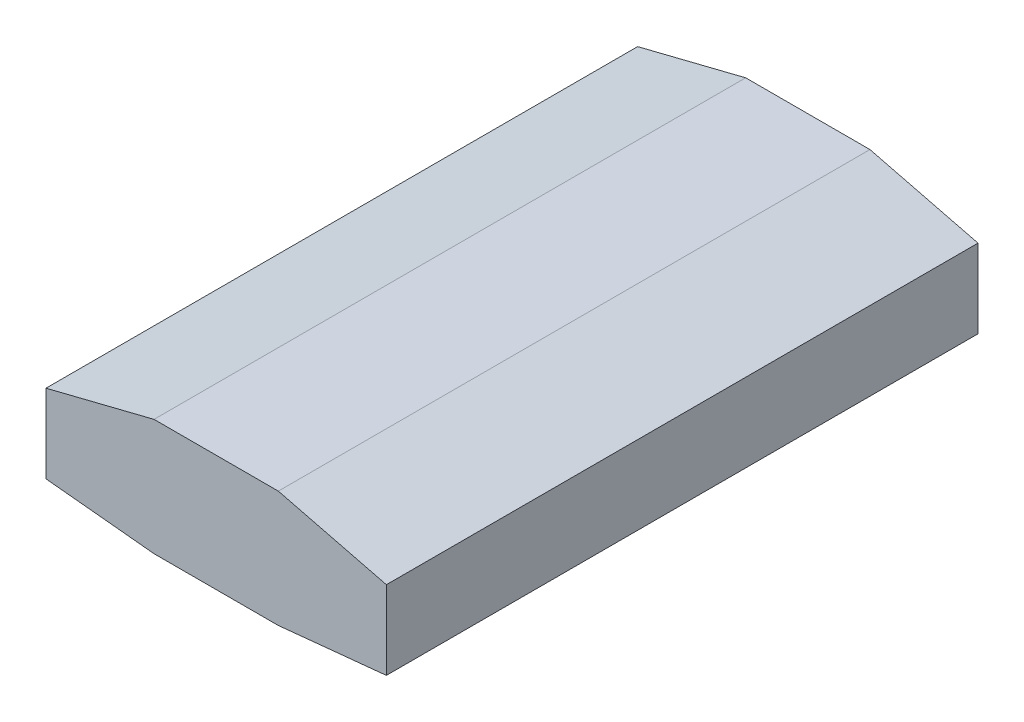
ISO-10303-21;
HEADER;
FILE_DESCRIPTION(('STEP AP214'),'2;1');
FILE_NAME('part.step','',(''),(''),'','','');
FILE_SCHEMA(('AUTOMOTIVE_DESIGN { 1 0 10303 214 1 1 1 1 }'));
ENDSEC;
DATA;
#1=APPLICATION_CONTEXT('core data for automotive mechanical design processes');
#2=APPLICATION_PROTOCOL_DEFINITION('international standard','automotive_design',2000,#1);
#3=PRODUCT_CONTEXT('',#1,'mechanical');
#4=PRODUCT('Part','Part','',(#3));
#5=PRODUCT_RELATED_PRODUCT_CATEGORY('part','',(#4));
#6=PRODUCT_DEFINITION_FORMATION('','',#4);
#7=PRODUCT_DEFINITION_CONTEXT('part definition',#1,'design');
#8=PRODUCT_DEFINITION('design','',#6,#7);
#9=PRODUCT_DEFINITION_SHAPE('','',#8);
#10=(LENGTH_UNIT() NAMED_UNIT(*) SI_UNIT(.MILLI.,.METRE.));
#11=(NAMED_UNIT(*) PLANE_ANGLE_UNIT() SI_UNIT($,.RADIAN.));
#12=(NAMED_UNIT(*) SI_UNIT($,.STERADIAN.) SOLID_ANGLE_UNIT());
#13=UNCERTAINTY_MEASURE_WITH_UNIT(LENGTH_MEASURE(1.E-05),#10,'distance_accuracy_value','');
#14=(GEOMETRIC_REPRESENTATION_CONTEXT(3) GLOBAL_UNCERTAINTY_ASSIGNED_CONTEXT((#13)) GLOBAL_UNIT_ASSIGNED_CONTEXT((#10,
#11,#12)) REPRESENTATION_CONTEXT('',''));
#15=CARTESIAN_POINT('',(0.,0.,0.));
#16=DIRECTION('',(0.,0.,1.));
#17=DIRECTION('',(1.,0.,0.));
#18=AXIS2_PLACEMENT_3D('',#15,#16,#17);
#19=CARTESIAN_POINT('',(31.5,10.77,109.5));
#20=DIRECTION('',(-1.,0.,0.));
#21=DIRECTION('',(0.,0.,1.));
#22=AXIS2_PLACEMENT_3D('',#19,#20,#21);
#23=PLANE('',#22);
#24=DIRECTION('',(0.,1.,0.));
#25=VECTOR('',#24,1.);
#26=CARTESIAN_POINT('',(31.5,10.77,109.5));
#27=LINE('',#26,#25);
#28=CARTESIAN_POINT('',(31.5,-8.77,109.5));
#29=VERTEX_POINT('',#28);
#30=CARTESIAN_POINT('',(31.5,5.77,109.5));
#31=VERTEX_POINT('',#30);
#32=EDGE_CURVE('E125',#29,#31,#27,.T.);
#33=ORIENTED_EDGE('',*,*,#32,.F.);
#34=DIRECTION('',(0.,0.,1.));
#35=VECTOR('',#34,1.);
#36=CARTESIAN_POINT('',(31.5,-8.77,0.));
#37=LINE('',#36,#35);
#38=CARTESIAN_POINT('',(31.5,-8.77,0.));
#39=VERTEX_POINT('',#38);
#40=EDGE_CURVE('E146',#39,#29,#37,.T.);
#41=ORIENTED_EDGE('',*,*,#40,.F.);
#42=DIRECTION('',(0.,1.,0.));
#43=VECTOR('',#42,1.);
#44=CARTESIAN_POINT('',(31.5,10.77,0.));
#45=LINE('',#44,#43);
#46=CARTESIAN_POINT('',(31.5,5.77,0.));
#47=VERTEX_POINT('',#46);
#48=EDGE_CURVE('E126',#39,#47,#45,.T.);
#49=ORIENTED_EDGE('',*,*,#48,.T.);
#50=DIRECTION('',(0.,0.,1.));
#51=VECTOR('',#50,1.);
#52=CARTESIAN_POINT('',(31.5,5.77,0.));
#53=LINE('',#52,#51);
#54=EDGE_CURVE('E129',#47,#31,#53,.T.);
#55=ORIENTED_EDGE('',*,*,#54,.T.);
#56=EDGE_LOOP('',(#33,#41,#49,#55));
#57=FACE_BOUND('',#56,.T.);
#58=ADVANCED_FACE('F35',(#57),#23,.F.);
#59=CARTESIAN_POINT('',(-31.5,10.77,109.5));
#60=DIRECTION('',(0.,-1.,0.));
#61=DIRECTION('',(0.,0.,-1.));
#62=AXIS2_PLACEMENT_3D('',#59,#60,#61);
#63=PLANE('',#62);
#64=DIRECTION('',(-1.,0.,0.));
#65=VECTOR('',#64,1.);
#66=CARTESIAN_POINT('',(-31.5,10.77,0.));
#67=LINE('',#66,#65);
#68=CARTESIAN_POINT('',(11.5,10.77,0.));
#69=VERTEX_POINT('',#68);
#70=CARTESIAN_POINT('',(-11.5000000000001,10.77,0.));
#71=VERTEX_POINT('',#70);
#72=EDGE_CURVE('E123',#69,#71,#67,.T.);
#73=ORIENTED_EDGE('',*,*,#72,.T.);
#74=DIRECTION('',(0.,0.,1.));
#75=VECTOR('',#74,1.);
#76=CARTESIAN_POINT('',(-11.5,10.77,0.));
#77=LINE('',#76,#75);
#78=CARTESIAN_POINT('',(-11.5,10.77,109.5));
#79=VERTEX_POINT('',#78);
#80=EDGE_CURVE('E106',#71,#79,#77,.T.);
#81=ORIENTED_EDGE('',*,*,#80,.T.);
#82=DIRECTION('',(-1.,0.,0.));
#83=VECTOR('',#82,1.);
#84=CARTESIAN_POINT('',(-31.5,10.77,109.5));
#85=LINE('',#84,#83);
#86=CARTESIAN_POINT('',(11.5,10.77,109.5));
#87=VERTEX_POINT('',#86);
#88=EDGE_CURVE('E132',#87,#79,#85,.T.);
#89=ORIENTED_EDGE('',*,*,#88,.F.);
#90=DIRECTION('',(0.,0.,1.));
#91=VECTOR('',#90,1.);
#92=CARTESIAN_POINT('',(11.5,10.77,0.));
#93=LINE('',#92,#91);
#94=EDGE_CURVE('E136',#69,#87,#93,.T.);
#95=ORIENTED_EDGE('',*,*,#94,.F.);
#96=EDGE_LOOP('',(#73,#81,#89,#95));
#97=FACE_BOUND('',#96,.T.);
#98=ADVANCED_FACE('F225',(#97),#63,.F.);
#99=CARTESIAN_POINT('',(-31.5,10.77,109.5));
#100=DIRECTION('',(1.,0.,0.));
#101=DIRECTION('',(0.,0.,-1.));
#102=AXIS2_PLACEMENT_3D('',#99,#100,#101);
#103=PLANE('',#102);
#104=DIRECTION('',(0.,-1.,0.));
#105=VECTOR('',#104,1.);
#106=CARTESIAN_POINT('',(-31.5,10.77,109.5));
#107=LINE('',#106,#105);
#108=CARTESIAN_POINT('',(-31.5,5.77,109.5));
#109=VERTEX_POINT('',#108);
#110=CARTESIAN_POINT('',(-31.5,-8.77,109.5));
#111=VERTEX_POINT('',#110);
#112=EDGE_CURVE('E43',#109,#111,#107,.T.);
#113=ORIENTED_EDGE('',*,*,#112,.F.);
#114=DIRECTION('',(0.,0.,1.));
#115=VECTOR('',#114,1.);
#116=CARTESIAN_POINT('',(-31.5,5.77,0.));
#117=LINE('',#116,#115);
#118=CARTESIAN_POINT('',(-31.5,5.77,0.));
#119=VERTEX_POINT('',#118);
#120=EDGE_CURVE('E103',#119,#109,#117,.T.);
#121=ORIENTED_EDGE('',*,*,#120,.F.);
#122=DIRECTION('',(0.,-1.,0.));
#123=VECTOR('',#122,1.);
#124=CARTESIAN_POINT('',(-31.5,10.77,0.));
#125=LINE('',#124,#123);
#126=CARTESIAN_POINT('',(-31.5,-8.77,0.));
#127=VERTEX_POINT('',#126);
#128=EDGE_CURVE('E117',#119,#127,#125,.T.);
#129=ORIENTED_EDGE('',*,*,#128,.T.);
#130=DIRECTION('',(0.,0.,1.));
#131=VECTOR('',#130,1.);
#132=CARTESIAN_POINT('',(-31.5,-8.77,0.));
#133=LINE('',#132,#131);
#134=EDGE_CURVE('E51',#127,#111,#133,.T.);
#135=ORIENTED_EDGE('',*,*,#134,.T.);
#136=EDGE_LOOP('',(#113,#121,#129,#135));
#137=FACE_BOUND('',#136,.T.);
#138=ADVANCED_FACE('F116',(#137),#103,.F.);
#139=CARTESIAN_POINT('',(-31.5,-10.77,109.5));
#140=DIRECTION('',(0.,1.,0.));
#141=DIRECTION('',(0.,0.,1.));
#142=AXIS2_PLACEMENT_3D('',#139,#140,#141);
#143=PLANE('',#142);
#144=CARTESIAN_POINT('',(7.,-10.77,5.));
#145=DIRECTION('',(0.,-1.,0.));
#146=DIRECTION('',(0.,0.,-1.));
#147=AXIS2_PLACEMENT_3D('',#144,#145,#146);
#148=CIRCLE('',#147,1.);
#149=CARTESIAN_POINT('',(7.,-10.77,4.));
#150=VERTEX_POINT('',#149);
#151=EDGE_CURVE('E180',#150,#150,#148,.T.);
#152=ORIENTED_EDGE('',*,*,#151,.F.);
#153=EDGE_LOOP('',(#152));
#154=FACE_BOUND('',#153,.T.);
#155=CARTESIAN_POINT('',(-7.,-10.77,85.));
#156=DIRECTION('',(0.,-1.,0.));
#157=DIRECTION('',(0.,0.,-1.));
#158=AXIS2_PLACEMENT_3D('',#155,#156,#157);
#159=CIRCLE('',#158,1.);
#160=CARTESIAN_POINT('',(-7.,-10.77,84.));
#161=VERTEX_POINT('',#160);
#162=EDGE_CURVE('E174',#161,#161,#159,.T.);
#163=ORIENTED_EDGE('',*,*,#162,.F.);
#164=EDGE_LOOP('',(#163));
#165=FACE_BOUND('',#164,.T.);
#166=CARTESIAN_POINT('',(7.,-10.77,85.));
#167=DIRECTION('',(0.,-1.,0.));
#168=DIRECTION('',(0.,0.,-1.));
#169=AXIS2_PLACEMENT_3D('',#166,#167,#168);
#170=CIRCLE('',#169,1.);
#171=CARTESIAN_POINT('',(7.,-10.77,84.));
#172=VERTEX_POINT('',#171);
#173=EDGE_CURVE('E168',#172,#172,#170,.T.);
#174=ORIENTED_EDGE('',*,*,#173,.F.);
#175=EDGE_LOOP('',(#174));
#176=FACE_BOUND('',#175,.T.);
#177=CARTESIAN_POINT('',(-7.,-10.77,5.));
#178=DIRECTION('',(0.,-1.,0.));
#179=DIRECTION('',(0.,0.,-1.));
#180=AXIS2_PLACEMENT_3D('',#177,#178,#179);
#181=CIRCLE('',#180,1.);
#182=CARTESIAN_POINT('',(-7.,-10.77,4.));
#183=VERTEX_POINT('',#182);
#184=EDGE_CURVE('E162',#183,#183,#181,.T.);
#185=ORIENTED_EDGE('',*,*,#184,.F.);
#186=EDGE_LOOP('',(#185));
#187=FACE_BOUND('',#186,.T.);
#188=DIRECTION('',(1.,0.,0.));
#189=VECTOR('',#188,1.);
#190=CARTESIAN_POINT('',(-31.5,-10.77,109.5));
#191=LINE('',#190,#189);
#192=CARTESIAN_POINT('',(-11.5,-10.77,109.5));
#193=VERTEX_POINT('',#192);
#194=CARTESIAN_POINT('',(11.5,-10.77,109.5));
#195=VERTEX_POINT('',#194);
#196=EDGE_CURVE('E11',#193,#195,#191,.T.);
#197=ORIENTED_EDGE('',*,*,#196,.F.);
#198=DIRECTION('',(0.,0.,1.));
#199=VECTOR('',#198,1.);
#200=CARTESIAN_POINT('',(-11.5,-10.77,0.));
#201=LINE('',#200,#199);
#202=CARTESIAN_POINT('',(-11.5,-10.77,0.));
#203=VERTEX_POINT('',#202);
#204=EDGE_CURVE('E155',#203,#193,#201,.T.);
#205=ORIENTED_EDGE('',*,*,#204,.F.);
#206=DIRECTION('',(1.,0.,0.));
#207=VECTOR('',#206,1.);
#208=CARTESIAN_POINT('',(-31.5,-10.77,0.));
#209=LINE('',#208,#207);
#210=CARTESIAN_POINT('',(11.4999999999993,-10.77,0.));
#211=VERTEX_POINT('',#210);
#212=EDGE_CURVE('E38',#203,#211,#209,.T.);
#213=ORIENTED_EDGE('',*,*,#212,.T.);
#214=DIRECTION('',(0.,0.,1.));
#215=VECTOR('',#214,1.);
#216=CARTESIAN_POINT('',(11.5,-10.77,0.));
#217=LINE('',#216,#215);
#218=EDGE_CURVE('E59',#211,#195,#217,.T.);
#219=ORIENTED_EDGE('',*,*,#218,.T.);
#220=EDGE_LOOP('',(#197,#205,#213,#219));
#221=FACE_BOUND('',#220,.T.);
#222=ADVANCED_FACE('F195',(#154,#165,#176,#187,#221),#143,.F.);
#223=CARTESIAN_POINT('',(0.,0.,109.5));
#224=DIRECTION('',(0.,0.,1.));
#225=DIRECTION('',(1.,0.,0.));
#226=AXIS2_PLACEMENT_3D('',#223,#224,#225);
#227=PLANE('',#226);
#228=DIRECTION('',(0.970142500145332,0.242535625036333,0.));
#229=VECTOR('',#228,1.);
#230=CARTESIAN_POINT('',(-11.5,10.77,109.5));
#231=LINE('',#230,#229);
#232=EDGE_CURVE('E111',#109,#79,#231,.T.);
#233=ORIENTED_EDGE('',*,*,#232,.F.);
#234=ORIENTED_EDGE('',*,*,#112,.T.);
#235=DIRECTION('',(-0.995037190209989,0.0995037190209989,0.));
#236=VECTOR('',#235,1.);
#237=CARTESIAN_POINT('',(-31.5,-8.77,109.5));
#238=LINE('',#237,#236);
#239=EDGE_CURVE('E150',#193,#111,#238,.T.);
#240=ORIENTED_EDGE('',*,*,#239,.F.);
#241=ORIENTED_EDGE('',*,*,#196,.T.);
#242=DIRECTION('',(-0.995037190209989,-0.0995037190209989,0.));
#243=VECTOR('',#242,1.);
#244=CARTESIAN_POINT('',(31.5,-8.77,109.5));
#245=LINE('',#244,#243);
#246=EDGE_CURVE('E151',#29,#195,#245,.T.);
#247=ORIENTED_EDGE('',*,*,#246,.F.);
#248=ORIENTED_EDGE('',*,*,#32,.T.);
#249=DIRECTION('',(0.970142500145332,-0.242535625036333,0.));
#250=VECTOR('',#249,1.);
#251=CARTESIAN_POINT('',(11.5,10.77,109.5));
#252=LINE('',#251,#250);
#253=EDGE_CURVE('E141',#87,#31,#252,.T.);
#254=ORIENTED_EDGE('',*,*,#253,.F.);
#255=ORIENTED_EDGE('',*,*,#88,.T.);
#256=EDGE_LOOP('',(#233,#234,#240,#241,#247,#248,#254,#255));
#257=FACE_BOUND('',#256,.T.);
#258=ADVANCED_FACE('F198',(#257),#227,.T.);
#259=CARTESIAN_POINT('',(0.,0.,0.));
#260=DIRECTION('',(0.,0.,1.));
#261=DIRECTION('',(1.,0.,0.));
#262=AXIS2_PLACEMENT_3D('',#259,#260,#261);
#263=PLANE('',#262);
#264=ORIENTED_EDGE('',*,*,#128,.F.);
#265=DIRECTION('',(0.970142500145332,0.242535625036333,0.));
#266=VECTOR('',#265,1.);
#267=CARTESIAN_POINT('',(-11.5,10.77,0.));
#268=LINE('',#267,#266);
#269=EDGE_CURVE('E100',#119,#71,#268,.T.);
#270=ORIENTED_EDGE('',*,*,#269,.T.);
#271=ORIENTED_EDGE('',*,*,#72,.F.);
#272=DIRECTION('',(0.970142500145332,-0.242535625036333,0.));
#273=VECTOR('',#272,1.);
#274=CARTESIAN_POINT('',(11.5,10.77,0.));
#275=LINE('',#274,#273);
#276=EDGE_CURVE('E138',#69,#47,#275,.T.);
#277=ORIENTED_EDGE('',*,*,#276,.T.);
#278=ORIENTED_EDGE('',*,*,#48,.F.);
#279=DIRECTION('',(-0.995037190209989,-0.0995037190209989,0.));
#280=VECTOR('',#279,1.);
#281=CARTESIAN_POINT('',(31.5,-8.77,0.));
#282=LINE('',#281,#280);
#283=EDGE_CURVE('E148',#39,#211,#282,.T.);
#284=ORIENTED_EDGE('',*,*,#283,.T.);
#285=ORIENTED_EDGE('',*,*,#212,.F.);
#286=DIRECTION('',(-0.995037190209989,0.0995037190209989,0.));
#287=VECTOR('',#286,1.);
#288=CARTESIAN_POINT('',(-31.5,-8.77,0.));
#289=LINE('',#288,#287);
#290=EDGE_CURVE('E122',#203,#127,#289,.T.);
#291=ORIENTED_EDGE('',*,*,#290,.T.);
#292=EDGE_LOOP('',(#264,#270,#271,#277,#278,#284,#285,#291));
#293=FACE_BOUND('',#292,.T.);
#294=ADVANCED_FACE('F120',(#293),#263,.F.);
#295=CARTESIAN_POINT('',(11.5,10.77,0.));
#296=DIRECTION('',(-0.242535625036333,-0.970142500145332,0.));
#297=DIRECTION('',(0.970142500145332,-0.242535625036333,0.));
#298=AXIS2_PLACEMENT_3D('',#295,#296,#297);
#299=PLANE('',#298);
#300=ORIENTED_EDGE('',*,*,#253,.T.);
#301=ORIENTED_EDGE('',*,*,#54,.F.);
#302=ORIENTED_EDGE('',*,*,#276,.F.);
#303=ORIENTED_EDGE('',*,*,#94,.T.);
#304=EDGE_LOOP('',(#300,#301,#302,#303));
#305=FACE_BOUND('',#304,.T.);
#306=ADVANCED_FACE('F222',(#305),#299,.F.);
#307=CARTESIAN_POINT('',(31.5,-8.77,0.));
#308=DIRECTION('',(-0.0995037190209989,0.995037190209989,0.));
#309=DIRECTION('',(-0.995037190209989,-0.0995037190209989,0.));
#310=AXIS2_PLACEMENT_3D('',#307,#308,#309);
#311=PLANE('',#310);
#312=ORIENTED_EDGE('',*,*,#246,.T.);
#313=ORIENTED_EDGE('',*,*,#218,.F.);
#314=ORIENTED_EDGE('',*,*,#283,.F.);
#315=ORIENTED_EDGE('',*,*,#40,.T.);
#316=EDGE_LOOP('',(#312,#313,#314,#315));
#317=FACE_BOUND('',#316,.T.);
#318=ADVANCED_FACE('F214',(#317),#311,.F.);
#319=CARTESIAN_POINT('',(-31.5,-8.77,0.));
#320=DIRECTION('',(0.0995037190209989,0.995037190209989,0.));
#321=DIRECTION('',(-0.995037190209989,0.0995037190209989,0.));
#322=AXIS2_PLACEMENT_3D('',#319,#320,#321);
#323=PLANE('',#322);
#324=ORIENTED_EDGE('',*,*,#239,.T.);
#325=ORIENTED_EDGE('',*,*,#134,.F.);
#326=ORIENTED_EDGE('',*,*,#290,.F.);
#327=ORIENTED_EDGE('',*,*,#204,.T.);
#328=EDGE_LOOP('',(#324,#325,#326,#327));
#329=FACE_BOUND('',#328,.T.);
#330=ADVANCED_FACE('F212',(#329),#323,.F.);
#331=CARTESIAN_POINT('',(-11.5,10.77,0.));
#332=DIRECTION('',(0.242535625036333,-0.970142500145332,0.));
#333=DIRECTION('',(0.970142500145332,0.242535625036333,0.));
#334=AXIS2_PLACEMENT_3D('',#331,#332,#333);
#335=PLANE('',#334);
#336=ORIENTED_EDGE('',*,*,#232,.T.);
#337=ORIENTED_EDGE('',*,*,#80,.F.);
#338=ORIENTED_EDGE('',*,*,#269,.F.);
#339=ORIENTED_EDGE('',*,*,#120,.T.);
#340=EDGE_LOOP('',(#336,#337,#338,#339));
#341=FACE_BOUND('',#340,.T.);
#342=ADVANCED_FACE('F102',(#341),#335,.F.);
#343=CARTESIAN_POINT('',(-7.,-5.77,5.));
#344=DIRECTION('',(0.,-1.,0.));
#345=DIRECTION('',(0.,0.,-1.));
#346=AXIS2_PLACEMENT_3D('',#343,#344,#345);
#347=CYLINDRICAL_SURFACE('',#346,1.);
#348=CARTESIAN_POINT('',(-7.,-5.77,5.));
#349=DIRECTION('',(0.,-1.,0.));
#350=DIRECTION('',(0.,0.,-1.));
#351=AXIS2_PLACEMENT_3D('',#348,#349,#350);
#352=CIRCLE('',#351,1.);
#353=CARTESIAN_POINT('',(-7.,-5.77,4.));
#354=VERTEX_POINT('',#353);
#355=EDGE_CURVE('E153',#354,#354,#352,.T.);
#356=ORIENTED_EDGE('',*,*,#355,.F.);
#357=EDGE_LOOP('',(#356));
#358=FACE_BOUND('',#357,.T.);
#359=ORIENTED_EDGE('',*,*,#184,.T.);
#360=EDGE_LOOP('',(#359));
#361=FACE_BOUND('',#360,.T.);
#362=ADVANCED_FACE('F220',(#358,#361),#347,.F.);
#363=CARTESIAN_POINT('',(-7.,-5.77,5.));
#364=DIRECTION('',(0.,-1.,0.));
#365=DIRECTION('',(0.,0.,-1.));
#366=AXIS2_PLACEMENT_3D('',#363,#364,#365);
#367=PLANE('',#366);
#368=ORIENTED_EDGE('',*,*,#355,.T.);
#369=EDGE_LOOP('',(#368));
#370=FACE_BOUND('',#369,.T.);
#371=ADVANCED_FACE('F293',(#370),#367,.T.);
#372=CARTESIAN_POINT('',(7.,-5.77,85.));
#373=DIRECTION('',(0.,-1.,0.));
#374=DIRECTION('',(0.,0.,-1.));
#375=AXIS2_PLACEMENT_3D('',#372,#373,#374);
#376=CYLINDRICAL_SURFACE('',#375,1.);
#377=CARTESIAN_POINT('',(7.,-5.77,85.));
#378=DIRECTION('',(0.,-1.,0.));
#379=DIRECTION('',(0.,0.,-1.));
#380=AXIS2_PLACEMENT_3D('',#377,#378,#379);
#381=CIRCLE('',#380,1.);
#382=CARTESIAN_POINT('',(7.,-5.77,84.));
#383=VERTEX_POINT('',#382);
#384=EDGE_CURVE('E171',#383,#383,#381,.T.);
#385=ORIENTED_EDGE('',*,*,#384,.F.);
#386=EDGE_LOOP('',(#385));
#387=FACE_BOUND('',#386,.T.);
#388=ORIENTED_EDGE('',*,*,#173,.T.);
#389=EDGE_LOOP('',(#388));
#390=FACE_BOUND('',#389,.T.);
#391=ADVANCED_FACE('F300',(#387,#390),#376,.F.);
#392=CARTESIAN_POINT('',(7.,-5.77,85.));
#393=DIRECTION('',(0.,-1.,0.));
#394=DIRECTION('',(0.,0.,-1.));
#395=AXIS2_PLACEMENT_3D('',#392,#393,#394);
#396=PLANE('',#395);
#397=ORIENTED_EDGE('',*,*,#384,.T.);
#398=EDGE_LOOP('',(#397));
#399=FACE_BOUND('',#398,.T.);
#400=ADVANCED_FACE('F308',(#399),#396,.T.);
#401=CARTESIAN_POINT('',(-7.,-5.77,85.));
#402=DIRECTION('',(0.,-1.,0.));
#403=DIRECTION('',(0.,0.,-1.));
#404=AXIS2_PLACEMENT_3D('',#401,#402,#403);
#405=CYLINDRICAL_SURFACE('',#404,1.);
#406=CARTESIAN_POINT('',(-7.,-5.77,85.));
#407=DIRECTION('',(0.,-1.,0.));
#408=DIRECTION('',(0.,0.,-1.));
#409=AXIS2_PLACEMENT_3D('',#406,#407,#408);
#410=CIRCLE('',#409,1.);
#411=CARTESIAN_POINT('',(-7.,-5.77,84.));
#412=VERTEX_POINT('',#411);
#413=EDGE_CURVE('E177',#412,#412,#410,.T.);
#414=ORIENTED_EDGE('',*,*,#413,.F.);
#415=EDGE_LOOP('',(#414));
#416=FACE_BOUND('',#415,.T.);
#417=ORIENTED_EDGE('',*,*,#162,.T.);
#418=EDGE_LOOP('',(#417));
#419=FACE_BOUND('',#418,.T.);
#420=ADVANCED_FACE('F316',(#416,#419),#405,.F.);
#421=CARTESIAN_POINT('',(-7.,-5.77,85.));
#422=DIRECTION('',(0.,-1.,0.));
#423=DIRECTION('',(0.,0.,-1.));
#424=AXIS2_PLACEMENT_3D('',#421,#422,#423);
#425=PLANE('',#424);
#426=ORIENTED_EDGE('',*,*,#413,.T.);
#427=EDGE_LOOP('',(#426));
#428=FACE_BOUND('',#427,.T.);
#429=ADVANCED_FACE('F191',(#428),#425,.T.);
#430=CARTESIAN_POINT('',(7.,-5.77,5.));
#431=DIRECTION('',(0.,-1.,0.));
#432=DIRECTION('',(0.,0.,-1.));
#433=AXIS2_PLACEMENT_3D('',#430,#431,#432);
#434=CYLINDRICAL_SURFACE('',#433,1.);
#435=CARTESIAN_POINT('',(7.,-5.77,5.));
#436=DIRECTION('',(0.,-1.,0.));
#437=DIRECTION('',(0.,0.,-1.));
#438=AXIS2_PLACEMENT_3D('',#435,#436,#437);
#439=CIRCLE('',#438,1.);
#440=CARTESIAN_POINT('',(7.,-5.77,4.));
#441=VERTEX_POINT('',#440);
#442=EDGE_CURVE('E165',#441,#441,#439,.T.);
#443=ORIENTED_EDGE('',*,*,#442,.F.);
#444=EDGE_LOOP('',(#443));
#445=FACE_BOUND('',#444,.T.);
#446=ORIENTED_EDGE('',*,*,#151,.T.);
#447=EDGE_LOOP('',(#446));
#448=FACE_BOUND('',#447,.T.);
#449=ADVANCED_FACE('F188',(#445,#448),#434,.F.);
#450=CARTESIAN_POINT('',(7.,-5.77,5.));
#451=DIRECTION('',(0.,-1.,0.));
#452=DIRECTION('',(0.,0.,-1.));
#453=AXIS2_PLACEMENT_3D('',#450,#451,#452);
#454=PLANE('',#453);
#455=ORIENTED_EDGE('',*,*,#442,.T.);
#456=EDGE_LOOP('',(#455));
#457=FACE_BOUND('',#456,.T.);
#458=ADVANCED_FACE('F186',(#457),#454,.T.);
#459=CLOSED_SHELL('',(#58,#98,#138,#222,#258,#294,#306,#318,#330,#342,#362,#371,#391,#400,#420,
#429,#449,#458));
#460=MANIFOLD_SOLID_BREP('B2',#459);
#461=ADVANCED_BREP_SHAPE_REPRESENTATION('',(#18,#460),#14);
#462=SHAPE_DEFINITION_REPRESENTATION(#9,#461);
ENDSEC;
END-ISO-10303-21;
